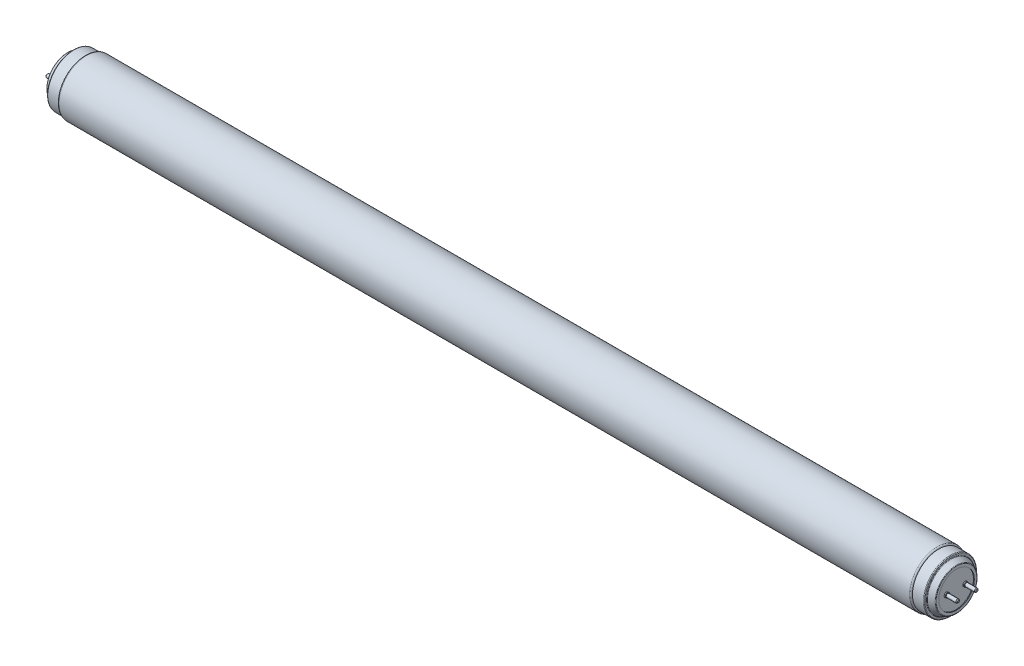
ISO-10303-21;
HEADER;
FILE_DESCRIPTION(('STEP AP214'),'2;1');
FILE_NAME('part.step','',(''),(''),'','','');
FILE_SCHEMA(('AUTOMOTIVE_DESIGN { 1 0 10303 214 1 1 1 1 }'));
ENDSEC;
DATA;
#1=APPLICATION_CONTEXT('core data for automotive mechanical design processes');
#2=APPLICATION_PROTOCOL_DEFINITION('international standard','automotive_design',2000,#1);
#3=PRODUCT_CONTEXT('',#1,'mechanical');
#4=PRODUCT('Part','Part','',(#3));
#5=PRODUCT_RELATED_PRODUCT_CATEGORY('part','',(#4));
#6=PRODUCT_DEFINITION_FORMATION('','',#4);
#7=PRODUCT_DEFINITION_CONTEXT('part definition',#1,'design');
#8=PRODUCT_DEFINITION('design','',#6,#7);
#9=PRODUCT_DEFINITION_SHAPE('','',#8);
#10=(LENGTH_UNIT() NAMED_UNIT(*) SI_UNIT(.MILLI.,.METRE.));
#11=(NAMED_UNIT(*) PLANE_ANGLE_UNIT() SI_UNIT($,.RADIAN.));
#12=(NAMED_UNIT(*) SI_UNIT($,.STERADIAN.) SOLID_ANGLE_UNIT());
#13=UNCERTAINTY_MEASURE_WITH_UNIT(LENGTH_MEASURE(1.E-05),#10,'distance_accuracy_value','');
#14=(GEOMETRIC_REPRESENTATION_CONTEXT(3) GLOBAL_UNCERTAINTY_ASSIGNED_CONTEXT((#13)) GLOBAL_UNIT_ASSIGNED_CONTEXT((#10,
#11,#12)) REPRESENTATION_CONTEXT('',''));
#15=CARTESIAN_POINT('',(0.,0.,0.));
#16=DIRECTION('',(0.,0.,1.));
#17=DIRECTION('',(1.,0.,0.));
#18=AXIS2_PLACEMENT_3D('',#15,#16,#17);
#19=CARTESIAN_POINT('',(587.5,-12.,0.));
#20=DIRECTION('',(-1.,0.,0.));
#21=DIRECTION('',(0.,0.,1.));
#22=AXIS2_PLACEMENT_3D('',#19,#20,#21);
#23=PLANE('',#22);
#24=CARTESIAN_POINT('',(587.5,0.,-6.3));
#25=DIRECTION('',(-1.,0.,0.));
#26=DIRECTION('',(0.,0.,1.));
#27=AXIS2_PLACEMENT_3D('',#24,#25,#26);
#28=CIRCLE('',#27,1.5);
#29=CARTESIAN_POINT('',(587.5,0.,-4.8));
#30=VERTEX_POINT('',#29);
#31=EDGE_CURVE('E77',#30,#30,#28,.F.);
#32=ORIENTED_EDGE('',*,*,#31,.F.);
#33=EDGE_LOOP('',(#32));
#34=FACE_BOUND('',#33,.T.);
#35=CARTESIAN_POINT('',(587.5,0.,0.));
#36=DIRECTION('',(1.,0.,0.));
#37=DIRECTION('',(0.,0.,-1.));
#38=AXIS2_PLACEMENT_3D('',#35,#36,#37);
#39=CIRCLE('',#38,12.);
#40=CARTESIAN_POINT('',(587.5,0.,-12.));
#41=VERTEX_POINT('',#40);
#42=EDGE_CURVE('E99',#41,#41,#39,.T.);
#43=ORIENTED_EDGE('',*,*,#42,.T.);
#44=EDGE_LOOP('',(#43));
#45=FACE_BOUND('',#44,.T.);
#46=CARTESIAN_POINT('',(587.5,0.,6.3));
#47=DIRECTION('',(-1.,0.,0.));
#48=DIRECTION('',(0.,0.,1.));
#49=AXIS2_PLACEMENT_3D('',#46,#47,#48);
#50=CIRCLE('',#49,1.5);
#51=CARTESIAN_POINT('',(587.5,0.,7.8));
#52=VERTEX_POINT('',#51);
#53=EDGE_CURVE('E74',#52,#52,#50,.F.);
#54=ORIENTED_EDGE('',*,*,#53,.F.);
#55=EDGE_LOOP('',(#54));
#56=FACE_BOUND('',#55,.T.);
#57=ADVANCED_FACE('F30',(#34,#45,#56),#23,.F.);
#58=CARTESIAN_POINT('',(-11.5,-12.,0.));
#59=DIRECTION('',(1.,0.,0.));
#60=DIRECTION('',(0.,0.,-1.));
#61=AXIS2_PLACEMENT_3D('',#58,#59,#60);
#62=PLANE('',#61);
#63=CARTESIAN_POINT('',(-11.5,0.,-6.3));
#64=DIRECTION('',(1.,0.,0.));
#65=DIRECTION('',(0.,0.,-1.));
#66=AXIS2_PLACEMENT_3D('',#63,#64,#65);
#67=CIRCLE('',#66,1.5);
#68=CARTESIAN_POINT('',(-11.5,0.,-7.8));
#69=VERTEX_POINT('',#68);
#70=EDGE_CURVE('E90',#69,#69,#67,.F.);
#71=ORIENTED_EDGE('',*,*,#70,.F.);
#72=EDGE_LOOP('',(#71));
#73=FACE_BOUND('',#72,.T.);
#74=CARTESIAN_POINT('',(-11.5,0.,0.));
#75=DIRECTION('',(1.,0.,0.));
#76=DIRECTION('',(0.,0.,-1.));
#77=AXIS2_PLACEMENT_3D('',#74,#75,#76);
#78=CIRCLE('',#77,12.);
#79=CARTESIAN_POINT('',(-11.5,0.,-12.));
#80=VERTEX_POINT('',#79);
#81=EDGE_CURVE('E96',#80,#80,#78,.T.);
#82=ORIENTED_EDGE('',*,*,#81,.F.);
#83=EDGE_LOOP('',(#82));
#84=FACE_BOUND('',#83,.T.);
#85=CARTESIAN_POINT('',(-11.5,0.,6.3));
#86=DIRECTION('',(1.,0.,0.));
#87=DIRECTION('',(0.,0.,-1.));
#88=AXIS2_PLACEMENT_3D('',#85,#86,#87);
#89=CIRCLE('',#88,1.5);
#90=CARTESIAN_POINT('',(-11.5,0.,4.8));
#91=VERTEX_POINT('',#90);
#92=EDGE_CURVE('E84',#91,#91,#89,.F.);
#93=ORIENTED_EDGE('',*,*,#92,.F.);
#94=EDGE_LOOP('',(#93));
#95=FACE_BOUND('',#94,.T.);
#96=ADVANCED_FACE('F273',(#73,#84,#95),#62,.F.);
#97=CARTESIAN_POINT('',(-11.5,0.,0.));
#98=DIRECTION('',(1.,0.,0.));
#99=DIRECTION('',(0.,0.,-1.));
#100=AXIS2_PLACEMENT_3D('',#97,#98,#99);
#101=CYLINDRICAL_SURFACE('',#100,12.);
#102=CARTESIAN_POINT('',(-12.,0.,0.));
#103=DIRECTION('',(1.,0.,0.));
#104=DIRECTION('',(0.,0.,-1.));
#105=AXIS2_PLACEMENT_3D('',#102,#103,#104);
#106=CIRCLE('',#105,12.);
#107=CARTESIAN_POINT('',(-12.,0.,-12.));
#108=VERTEX_POINT('',#107);
#109=EDGE_CURVE('E102',#108,#108,#106,.T.);
#110=ORIENTED_EDGE('',*,*,#109,.F.);
#111=EDGE_LOOP('',(#110));
#112=FACE_BOUND('',#111,.T.);
#113=ORIENTED_EDGE('',*,*,#81,.T.);
#114=EDGE_LOOP('',(#113));
#115=FACE_BOUND('',#114,.T.);
#116=ADVANCED_FACE('F267',(#112,#115),#101,.F.);
#117=CARTESIAN_POINT('',(-12.,-13.6909830056251,0.));
#118=DIRECTION('',(1.,0.,0.));
#119=DIRECTION('',(0.,0.,-1.));
#120=AXIS2_PLACEMENT_3D('',#117,#118,#119);
#121=PLANE('',#120);
#122=CARTESIAN_POINT('',(-12.,0.,0.));
#123=DIRECTION('',(1.,0.,0.));
#124=DIRECTION('',(0.,0.,-1.));
#125=AXIS2_PLACEMENT_3D('',#122,#123,#124);
#126=CIRCLE('',#125,13.6909830056251);
#127=CARTESIAN_POINT('',(-12.,0.,-13.6909830056251));
#128=VERTEX_POINT('',#127);
#129=EDGE_CURVE('E105',#128,#128,#126,.T.);
#130=ORIENTED_EDGE('',*,*,#129,.F.);
#131=EDGE_LOOP('',(#130));
#132=FACE_BOUND('',#131,.T.);
#133=ORIENTED_EDGE('',*,*,#109,.T.);
#134=EDGE_LOOP('',(#133));
#135=FACE_BOUND('',#134,.T.);
#136=ADVANCED_FACE('F261',(#132,#135),#121,.F.);
#137=CARTESIAN_POINT('',(-11.5,0.,0.));
#138=DIRECTION('',(1.,0.,0.));
#139=DIRECTION('',(0.,0.,-1.));
#140=AXIS2_PLACEMENT_3D('',#137,#138,#139);
#141=TOROIDAL_SURFACE('',#140,13.6909830056251,0.5);
#142=CARTESIAN_POINT('',(-11.72360679775,0.,0.));
#143=DIRECTION('',(1.,0.,0.));
#144=DIRECTION('',(0.,0.,-1.));
#145=AXIS2_PLACEMENT_3D('',#142,#143,#144);
#146=CIRCLE('',#145,14.138196601125);
#147=CARTESIAN_POINT('',(-11.72360679775,0.,-14.138196601125));
#148=VERTEX_POINT('',#147);
#149=EDGE_CURVE('E108',#148,#148,#146,.T.);
#150=ORIENTED_EDGE('',*,*,#149,.F.);
#151=EDGE_LOOP('',(#150));
#152=FACE_BOUND('',#151,.T.);
#153=ORIENTED_EDGE('',*,*,#129,.T.);
#154=EDGE_LOOP('',(#153));
#155=FACE_BOUND('',#154,.T.);
#156=ADVANCED_FACE('F255',(#152,#155),#141,.T.);
#157=CARTESIAN_POINT('',(-11.72360679775,0.,0.));
#158=DIRECTION('',(1.,0.,0.));
#159=DIRECTION('',(0.,0.,-1.));
#160=AXIS2_PLACEMENT_3D('',#157,#158,#159);
#161=CONICAL_SURFACE('',#160,14.138196601125,0.463647609000806);
#162=CARTESIAN_POINT('',(-8.27639320225002,0.,0.));
#163=DIRECTION('',(1.,0.,0.));
#164=DIRECTION('',(0.,0.,-1.));
#165=AXIS2_PLACEMENT_3D('',#162,#163,#164);
#166=CIRCLE('',#165,15.861803398875);
#167=CARTESIAN_POINT('',(-8.27639320225002,0.,-15.861803398875));
#168=VERTEX_POINT('',#167);
#169=EDGE_CURVE('E111',#168,#168,#166,.T.);
#170=ORIENTED_EDGE('',*,*,#169,.F.);
#171=EDGE_LOOP('',(#170));
#172=FACE_BOUND('',#171,.T.);
#173=ORIENTED_EDGE('',*,*,#149,.T.);
#174=EDGE_LOOP('',(#173));
#175=FACE_BOUND('',#174,.T.);
#176=ADVANCED_FACE('F249',(#172,#175),#161,.T.);
#177=CARTESIAN_POINT('',(-8.5,0.,0.));
#178=DIRECTION('',(1.,0.,0.));
#179=DIRECTION('',(0.,0.,-1.));
#180=AXIS2_PLACEMENT_3D('',#177,#178,#179);
#181=TOROIDAL_SURFACE('',#180,16.309016994375,0.500000000000001);
#182=CARTESIAN_POINT('',(-8.,0.,0.));
#183=DIRECTION('',(1.,0.,0.));
#184=DIRECTION('',(0.,0.,-1.));
#185=AXIS2_PLACEMENT_3D('',#182,#183,#184);
#186=CIRCLE('',#185,16.309016994375);
#187=CARTESIAN_POINT('',(-8.,0.,-16.309016994375));
#188=VERTEX_POINT('',#187);
#189=EDGE_CURVE('E114',#188,#188,#186,.T.);
#190=ORIENTED_EDGE('',*,*,#189,.F.);
#191=EDGE_LOOP('',(#190));
#192=FACE_BOUND('',#191,.T.);
#193=ORIENTED_EDGE('',*,*,#169,.T.);
#194=EDGE_LOOP('',(#193));
#195=FACE_BOUND('',#194,.T.);
#196=ADVANCED_FACE('F243',(#192,#195),#181,.F.);
#197=CARTESIAN_POINT('',(-8.,-17.25,0.));
#198=DIRECTION('',(1.,0.,0.));
#199=DIRECTION('',(0.,0.,-1.));
#200=AXIS2_PLACEMENT_3D('',#197,#198,#199);
#201=PLANE('',#200);
#202=CARTESIAN_POINT('',(-8.,0.,0.));
#203=DIRECTION('',(1.,0.,0.));
#204=DIRECTION('',(0.,0.,-1.));
#205=AXIS2_PLACEMENT_3D('',#202,#203,#204);
#206=CIRCLE('',#205,17.25);
#207=CARTESIAN_POINT('',(-8.,0.,-17.25));
#208=VERTEX_POINT('',#207);
#209=EDGE_CURVE('E117',#208,#208,#206,.T.);
#210=ORIENTED_EDGE('',*,*,#209,.F.);
#211=EDGE_LOOP('',(#210));
#212=FACE_BOUND('',#211,.T.);
#213=ORIENTED_EDGE('',*,*,#189,.T.);
#214=EDGE_LOOP('',(#213));
#215=FACE_BOUND('',#214,.T.);
#216=ADVANCED_FACE('F237',(#212,#215),#201,.F.);
#217=CARTESIAN_POINT('',(-7.5,0.,0.));
#218=DIRECTION('',(1.,0.,0.));
#219=DIRECTION('',(0.,0.,-1.));
#220=AXIS2_PLACEMENT_3D('',#217,#218,#219);
#221=TOROIDAL_SURFACE('',#220,17.25,0.5);
#222=CARTESIAN_POINT('',(-7.49999999999999,0.,0.));
#223=DIRECTION('',(1.,0.,0.));
#224=DIRECTION('',(0.,0.,-1.));
#225=AXIS2_PLACEMENT_3D('',#222,#223,#224);
#226=CIRCLE('',#225,17.75);
#227=CARTESIAN_POINT('',(-7.49999999999999,0.,-17.75));
#228=VERTEX_POINT('',#227);
#229=EDGE_CURVE('E120',#228,#228,#226,.T.);
#230=ORIENTED_EDGE('',*,*,#229,.F.);
#231=EDGE_LOOP('',(#230));
#232=FACE_BOUND('',#231,.T.);
#233=ORIENTED_EDGE('',*,*,#209,.T.);
#234=EDGE_LOOP('',(#233));
#235=FACE_BOUND('',#234,.T.);
#236=ADVANCED_FACE('F231',(#232,#235),#221,.T.);
#237=CARTESIAN_POINT('',(-11.5,0.,0.));
#238=DIRECTION('',(1.,0.,0.));
#239=DIRECTION('',(0.,0.,-1.));
#240=AXIS2_PLACEMENT_3D('',#237,#238,#239);
#241=CYLINDRICAL_SURFACE('',#240,17.75);
#242=CARTESIAN_POINT('',(0.,0.,0.));
#243=DIRECTION('',(1.,0.,0.));
#244=DIRECTION('',(0.,0.,-1.));
#245=AXIS2_PLACEMENT_3D('',#242,#243,#244);
#246=CIRCLE('',#245,17.75);
#247=CARTESIAN_POINT('',(0.,0.,-17.75));
#248=VERTEX_POINT('',#247);
#249=EDGE_CURVE('E123',#248,#248,#246,.T.);
#250=ORIENTED_EDGE('',*,*,#249,.F.);
#251=EDGE_LOOP('',(#250));
#252=FACE_BOUND('',#251,.T.);
#253=ORIENTED_EDGE('',*,*,#229,.T.);
#254=EDGE_LOOP('',(#253));
#255=FACE_BOUND('',#254,.T.);
#256=ADVANCED_FACE('F225',(#252,#255),#241,.T.);
#257=CARTESIAN_POINT('',(0.950000000000002,0.,0.));
#258=DIRECTION('',(1.,0.,0.));
#259=DIRECTION('',(0.,0.,-1.));
#260=AXIS2_PLACEMENT_3D('',#257,#258,#259);
#261=TOROIDAL_SURFACE('',#260,17.75,0.950000000000001);
#262=CARTESIAN_POINT('',(0.950000000000001,0.,0.));
#263=DIRECTION('',(1.,0.,0.));
#264=DIRECTION('',(0.,0.,-1.));
#265=AXIS2_PLACEMENT_3D('',#262,#263,#264);
#266=CIRCLE('',#265,18.7);
#267=CARTESIAN_POINT('',(0.950000000000001,0.,-18.7));
#268=VERTEX_POINT('',#267);
#269=EDGE_CURVE('E126',#268,#268,#266,.T.);
#270=ORIENTED_EDGE('',*,*,#269,.F.);
#271=EDGE_LOOP('',(#270));
#272=FACE_BOUND('',#271,.T.);
#273=ORIENTED_EDGE('',*,*,#249,.T.);
#274=EDGE_LOOP('',(#273));
#275=FACE_BOUND('',#274,.T.);
#276=ADVANCED_FACE('F219',(#272,#275),#261,.T.);
#277=CARTESIAN_POINT('',(-11.5,0.,0.));
#278=DIRECTION('',(1.,0.,0.));
#279=DIRECTION('',(0.,0.,-1.));
#280=AXIS2_PLACEMENT_3D('',#277,#278,#279);
#281=CYLINDRICAL_SURFACE('',#280,18.7);
#282=CARTESIAN_POINT('',(575.05,0.,0.));
#283=DIRECTION('',(1.,0.,0.));
#284=DIRECTION('',(0.,0.,-1.));
#285=AXIS2_PLACEMENT_3D('',#282,#283,#284);
#286=CIRCLE('',#285,18.7);
#287=CARTESIAN_POINT('',(575.05,0.,-18.7));
#288=VERTEX_POINT('',#287);
#289=EDGE_CURVE('E129',#288,#288,#286,.T.);
#290=ORIENTED_EDGE('',*,*,#289,.F.);
#291=EDGE_LOOP('',(#290));
#292=FACE_BOUND('',#291,.T.);
#293=ORIENTED_EDGE('',*,*,#269,.T.);
#294=EDGE_LOOP('',(#293));
#295=FACE_BOUND('',#294,.T.);
#296=ADVANCED_FACE('F213',(#292,#295),#281,.T.);
#297=CARTESIAN_POINT('',(575.05,0.,0.));
#298=DIRECTION('',(1.,0.,0.));
#299=DIRECTION('',(0.,0.,-1.));
#300=AXIS2_PLACEMENT_3D('',#297,#298,#299);
#301=TOROIDAL_SURFACE('',#300,17.75,0.950000000000005);
#302=CARTESIAN_POINT('',(576.,0.,0.));
#303=DIRECTION('',(1.,0.,0.));
#304=DIRECTION('',(0.,0.,-1.));
#305=AXIS2_PLACEMENT_3D('',#302,#303,#304);
#306=CIRCLE('',#305,17.75);
#307=CARTESIAN_POINT('',(576.,0.,-17.75));
#308=VERTEX_POINT('',#307);
#309=EDGE_CURVE('E132',#308,#308,#306,.T.);
#310=ORIENTED_EDGE('',*,*,#309,.F.);
#311=EDGE_LOOP('',(#310));
#312=FACE_BOUND('',#311,.T.);
#313=ORIENTED_EDGE('',*,*,#289,.T.);
#314=EDGE_LOOP('',(#313));
#315=FACE_BOUND('',#314,.T.);
#316=ADVANCED_FACE('F207',(#312,#315),#301,.T.);
#317=CARTESIAN_POINT('',(-11.5,0.,0.));
#318=DIRECTION('',(1.,0.,0.));
#319=DIRECTION('',(0.,0.,-1.));
#320=AXIS2_PLACEMENT_3D('',#317,#318,#319);
#321=CYLINDRICAL_SURFACE('',#320,17.75);
#322=CARTESIAN_POINT('',(583.5,0.,0.));
#323=DIRECTION('',(1.,0.,0.));
#324=DIRECTION('',(0.,0.,-1.));
#325=AXIS2_PLACEMENT_3D('',#322,#323,#324);
#326=CIRCLE('',#325,17.75);
#327=CARTESIAN_POINT('',(583.5,0.,-17.75));
#328=VERTEX_POINT('',#327);
#329=EDGE_CURVE('E135',#328,#328,#326,.T.);
#330=ORIENTED_EDGE('',*,*,#329,.F.);
#331=EDGE_LOOP('',(#330));
#332=FACE_BOUND('',#331,.T.);
#333=ORIENTED_EDGE('',*,*,#309,.T.);
#334=EDGE_LOOP('',(#333));
#335=FACE_BOUND('',#334,.T.);
#336=ADVANCED_FACE('F201',(#332,#335),#321,.T.);
#337=CARTESIAN_POINT('',(583.5,0.,0.));
#338=DIRECTION('',(1.,0.,0.));
#339=DIRECTION('',(0.,0.,-1.));
#340=AXIS2_PLACEMENT_3D('',#337,#338,#339);
#341=TOROIDAL_SURFACE('',#340,17.25,0.499999999999974);
#342=CARTESIAN_POINT('',(584.,0.,0.));
#343=DIRECTION('',(1.,0.,0.));
#344=DIRECTION('',(0.,0.,-1.));
#345=AXIS2_PLACEMENT_3D('',#342,#343,#344);
#346=CIRCLE('',#345,17.25);
#347=CARTESIAN_POINT('',(584.,0.,-17.25));
#348=VERTEX_POINT('',#347);
#349=EDGE_CURVE('E138',#348,#348,#346,.T.);
#350=ORIENTED_EDGE('',*,*,#349,.F.);
#351=EDGE_LOOP('',(#350));
#352=FACE_BOUND('',#351,.T.);
#353=ORIENTED_EDGE('',*,*,#329,.T.);
#354=EDGE_LOOP('',(#353));
#355=FACE_BOUND('',#354,.T.);
#356=ADVANCED_FACE('F195',(#352,#355),#341,.T.);
#357=CARTESIAN_POINT('',(584.,-17.25,0.));
#358=DIRECTION('',(-1.,0.,0.));
#359=DIRECTION('',(0.,0.,1.));
#360=AXIS2_PLACEMENT_3D('',#357,#358,#359);
#361=PLANE('',#360);
#362=CARTESIAN_POINT('',(584.,0.,0.));
#363=DIRECTION('',(1.,0.,0.));
#364=DIRECTION('',(0.,0.,-1.));
#365=AXIS2_PLACEMENT_3D('',#362,#363,#364);
#366=CIRCLE('',#365,16.3090169943749);
#367=CARTESIAN_POINT('',(584.,0.,-16.3090169943749));
#368=VERTEX_POINT('',#367);
#369=EDGE_CURVE('E141',#368,#368,#366,.T.);
#370=ORIENTED_EDGE('',*,*,#369,.F.);
#371=EDGE_LOOP('',(#370));
#372=FACE_BOUND('',#371,.T.);
#373=ORIENTED_EDGE('',*,*,#349,.T.);
#374=EDGE_LOOP('',(#373));
#375=FACE_BOUND('',#374,.T.);
#376=ADVANCED_FACE('F189',(#372,#375),#361,.F.);
#377=CARTESIAN_POINT('',(584.5,0.,0.));
#378=DIRECTION('',(1.,0.,0.));
#379=DIRECTION('',(0.,0.,-1.));
#380=AXIS2_PLACEMENT_3D('',#377,#378,#379);
#381=TOROIDAL_SURFACE('',#380,16.3090169943749,0.500000000000037);
#382=CARTESIAN_POINT('',(584.27639320225,0.,0.));
#383=DIRECTION('',(1.,0.,0.));
#384=DIRECTION('',(0.,0.,-1.));
#385=AXIS2_PLACEMENT_3D('',#382,#383,#384);
#386=CIRCLE('',#385,15.861803398875);
#387=CARTESIAN_POINT('',(584.27639320225,0.,-15.861803398875));
#388=VERTEX_POINT('',#387);
#389=EDGE_CURVE('E144',#388,#388,#386,.T.);
#390=ORIENTED_EDGE('',*,*,#389,.F.);
#391=EDGE_LOOP('',(#390));
#392=FACE_BOUND('',#391,.T.);
#393=ORIENTED_EDGE('',*,*,#369,.T.);
#394=EDGE_LOOP('',(#393));
#395=FACE_BOUND('',#394,.T.);
#396=ADVANCED_FACE('F183',(#392,#395),#381,.F.);
#397=CARTESIAN_POINT('',(584.27639320225,0.,0.));
#398=DIRECTION('',(-1.,0.,0.));
#399=DIRECTION('',(0.,0.,1.));
#400=AXIS2_PLACEMENT_3D('',#397,#398,#399);
#401=CONICAL_SURFACE('',#400,15.861803398875,0.463647609000804);
#402=CARTESIAN_POINT('',(587.72360679775,0.,0.));
#403=DIRECTION('',(1.,0.,0.));
#404=DIRECTION('',(0.,0.,-1.));
#405=AXIS2_PLACEMENT_3D('',#402,#403,#404);
#406=CIRCLE('',#405,14.138196601125);
#407=CARTESIAN_POINT('',(587.72360679775,0.,-14.138196601125));
#408=VERTEX_POINT('',#407);
#409=EDGE_CURVE('E147',#408,#408,#406,.T.);
#410=ORIENTED_EDGE('',*,*,#409,.F.);
#411=EDGE_LOOP('',(#410));
#412=FACE_BOUND('',#411,.T.);
#413=ORIENTED_EDGE('',*,*,#389,.T.);
#414=EDGE_LOOP('',(#413));
#415=FACE_BOUND('',#414,.T.);
#416=ADVANCED_FACE('F177',(#412,#415),#401,.T.);
#417=CARTESIAN_POINT('',(587.5,0.,0.));
#418=DIRECTION('',(1.,0.,0.));
#419=DIRECTION('',(0.,0.,-1.));
#420=AXIS2_PLACEMENT_3D('',#417,#418,#419);
#421=TOROIDAL_SURFACE('',#420,13.6909830056251,0.499999999999957);
#422=CARTESIAN_POINT('',(588.,0.,0.));
#423=DIRECTION('',(1.,0.,0.));
#424=DIRECTION('',(0.,0.,-1.));
#425=AXIS2_PLACEMENT_3D('',#422,#423,#424);
#426=CIRCLE('',#425,13.6909830056251);
#427=CARTESIAN_POINT('',(588.,0.,-13.6909830056251));
#428=VERTEX_POINT('',#427);
#429=EDGE_CURVE('E150',#428,#428,#426,.T.);
#430=ORIENTED_EDGE('',*,*,#429,.F.);
#431=EDGE_LOOP('',(#430));
#432=FACE_BOUND('',#431,.T.);
#433=ORIENTED_EDGE('',*,*,#409,.T.);
#434=EDGE_LOOP('',(#433));
#435=FACE_BOUND('',#434,.T.);
#436=ADVANCED_FACE('F171',(#432,#435),#421,.T.);
#437=CARTESIAN_POINT('',(588.,-13.6909830056251,0.));
#438=DIRECTION('',(-1.,0.,0.));
#439=DIRECTION('',(0.,0.,1.));
#440=AXIS2_PLACEMENT_3D('',#437,#438,#439);
#441=PLANE('',#440);
#442=CARTESIAN_POINT('',(588.,0.,0.));
#443=DIRECTION('',(1.,0.,0.));
#444=DIRECTION('',(0.,0.,-1.));
#445=AXIS2_PLACEMENT_3D('',#442,#443,#444);
#446=CIRCLE('',#445,12.);
#447=CARTESIAN_POINT('',(588.,0.,-12.));
#448=VERTEX_POINT('',#447);
#449=EDGE_CURVE('E153',#448,#448,#446,.T.);
#450=ORIENTED_EDGE('',*,*,#449,.F.);
#451=EDGE_LOOP('',(#450));
#452=FACE_BOUND('',#451,.T.);
#453=ORIENTED_EDGE('',*,*,#429,.T.);
#454=EDGE_LOOP('',(#453));
#455=FACE_BOUND('',#454,.T.);
#456=ADVANCED_FACE('F165',(#452,#455),#441,.F.);
#457=CARTESIAN_POINT('',(-11.5,0.,0.));
#458=DIRECTION('',(1.,0.,0.));
#459=DIRECTION('',(0.,0.,-1.));
#460=AXIS2_PLACEMENT_3D('',#457,#458,#459);
#461=CYLINDRICAL_SURFACE('',#460,12.);
#462=ORIENTED_EDGE('',*,*,#42,.F.);
#463=EDGE_LOOP('',(#462));
#464=FACE_BOUND('',#463,.T.);
#465=ORIENTED_EDGE('',*,*,#449,.T.);
#466=EDGE_LOOP('',(#465));
#467=FACE_BOUND('',#466,.T.);
#468=ADVANCED_FACE('F161',(#464,#467),#461,.F.);
#469=CARTESIAN_POINT('',(-12.5,0.,-6.3));
#470=DIRECTION('',(1.,0.,0.));
#471=DIRECTION('',(0.,0.,-1.));
#472=AXIS2_PLACEMENT_3D('',#469,#470,#471);
#473=CYLINDRICAL_SURFACE('',#472,1.5);
#474=CARTESIAN_POINT('',(-12.2,0.,-6.3));
#475=DIRECTION('',(-1.,0.,0.));
#476=DIRECTION('',(0.,0.,1.));
#477=AXIS2_PLACEMENT_3D('',#474,#475,#476);
#478=CIRCLE('',#477,1.5);
#479=CARTESIAN_POINT('',(-12.2,0.,-4.8));
#480=VERTEX_POINT('',#479);
#481=EDGE_CURVE('E62',#480,#480,#478,.F.);
#482=ORIENTED_EDGE('',*,*,#481,.T.);
#483=EDGE_LOOP('',(#482));
#484=FACE_BOUND('',#483,.T.);
#485=ORIENTED_EDGE('',*,*,#70,.T.);
#486=EDGE_LOOP('',(#485));
#487=FACE_BOUND('',#486,.T.);
#488=ADVANCED_FACE('F164',(#484,#487),#473,.T.);
#489=CARTESIAN_POINT('',(-19.5,0.,-6.3));
#490=DIRECTION('',(-1.,0.,0.));
#491=DIRECTION('',(0.,0.,1.));
#492=AXIS2_PLACEMENT_3D('',#489,#490,#491);
#493=PLANE('',#492);
#494=CARTESIAN_POINT('',(-19.5,0.,-6.3));
#495=DIRECTION('',(-1.,0.,0.));
#496=DIRECTION('',(0.,0.,1.));
#497=AXIS2_PLACEMENT_3D('',#494,#495,#496);
#498=CIRCLE('',#497,0.700000000000089);
#499=CARTESIAN_POINT('',(-19.5,0.,-5.59999999999991));
#500=VERTEX_POINT('',#499);
#501=EDGE_CURVE('E37',#500,#500,#498,.T.);
#502=ORIENTED_EDGE('',*,*,#501,.T.);
#503=EDGE_LOOP('',(#502));
#504=FACE_BOUND('',#503,.T.);
#505=ADVANCED_FACE('F296',(#504),#493,.T.);
#506=CARTESIAN_POINT('',(-19.5,0.,-6.3));
#507=DIRECTION('',(1.,0.,0.));
#508=DIRECTION('',(0.,0.,-1.));
#509=AXIS2_PLACEMENT_3D('',#506,#507,#508);
#510=CYLINDRICAL_SURFACE('',#509,1.2);
#511=CARTESIAN_POINT('',(-19.0000000000001,0.,-6.3));
#512=DIRECTION('',(-1.,0.,0.));
#513=DIRECTION('',(0.,0.,1.));
#514=AXIS2_PLACEMENT_3D('',#511,#512,#513);
#515=CIRCLE('',#514,1.2);
#516=CARTESIAN_POINT('',(-19.0000000000001,0.,-5.1));
#517=VERTEX_POINT('',#516);
#518=EDGE_CURVE('E10',#517,#517,#515,.F.);
#519=ORIENTED_EDGE('',*,*,#518,.T.);
#520=EDGE_LOOP('',(#519));
#521=FACE_BOUND('',#520,.T.);
#522=CARTESIAN_POINT('',(-12.5,0.,-6.3));
#523=DIRECTION('',(-1.,0.,0.));
#524=DIRECTION('',(0.,0.,1.));
#525=AXIS2_PLACEMENT_3D('',#522,#523,#524);
#526=CIRCLE('',#525,1.2);
#527=CARTESIAN_POINT('',(-12.5,0.,-5.1));
#528=VERTEX_POINT('',#527);
#529=EDGE_CURVE('E93',#528,#528,#526,.T.);
#530=ORIENTED_EDGE('',*,*,#529,.T.);
#531=EDGE_LOOP('',(#530));
#532=FACE_BOUND('',#531,.T.);
#533=ADVANCED_FACE('F286',(#521,#532),#510,.T.);
#534=CARTESIAN_POINT('',(-12.5,0.,6.3));
#535=DIRECTION('',(1.,0.,0.));
#536=DIRECTION('',(0.,0.,-1.));
#537=AXIS2_PLACEMENT_3D('',#534,#535,#536);
#538=CYLINDRICAL_SURFACE('',#537,1.5);
#539=CARTESIAN_POINT('',(-12.2,0.,6.3));
#540=DIRECTION('',(-1.,0.,0.));
#541=DIRECTION('',(0.,0.,1.));
#542=AXIS2_PLACEMENT_3D('',#539,#540,#541);
#543=CIRCLE('',#542,1.5);
#544=CARTESIAN_POINT('',(-12.2,0.,7.8));
#545=VERTEX_POINT('',#544);
#546=EDGE_CURVE('E65',#545,#545,#543,.F.);
#547=ORIENTED_EDGE('',*,*,#546,.T.);
#548=EDGE_LOOP('',(#547));
#549=FACE_BOUND('',#548,.T.);
#550=ORIENTED_EDGE('',*,*,#92,.T.);
#551=EDGE_LOOP('',(#550));
#552=FACE_BOUND('',#551,.T.);
#553=ADVANCED_FACE('F283',(#549,#552),#538,.T.);
#554=CARTESIAN_POINT('',(-19.5,0.,6.3));
#555=DIRECTION('',(-1.,0.,0.));
#556=DIRECTION('',(0.,0.,1.));
#557=AXIS2_PLACEMENT_3D('',#554,#555,#556);
#558=PLANE('',#557);
#559=CARTESIAN_POINT('',(-19.5,0.,6.3));
#560=DIRECTION('',(-1.,0.,0.));
#561=DIRECTION('',(0.,0.,1.));
#562=AXIS2_PLACEMENT_3D('',#559,#560,#561);
#563=CIRCLE('',#562,0.700000000000089);
#564=CARTESIAN_POINT('',(-19.5,0.,7.00000000000009));
#565=VERTEX_POINT('',#564);
#566=EDGE_CURVE('E45',#565,#565,#563,.T.);
#567=ORIENTED_EDGE('',*,*,#566,.T.);
#568=EDGE_LOOP('',(#567));
#569=FACE_BOUND('',#568,.T.);
#570=ADVANCED_FACE('F285',(#569),#558,.T.);
#571=CARTESIAN_POINT('',(-19.5,0.,6.3));
#572=DIRECTION('',(1.,0.,0.));
#573=DIRECTION('',(0.,0.,-1.));
#574=AXIS2_PLACEMENT_3D('',#571,#572,#573);
#575=CYLINDRICAL_SURFACE('',#574,1.2);
#576=CARTESIAN_POINT('',(-19.0000000000001,0.,6.3));
#577=DIRECTION('',(-1.,0.,0.));
#578=DIRECTION('',(0.,0.,1.));
#579=AXIS2_PLACEMENT_3D('',#576,#577,#578);
#580=CIRCLE('',#579,1.2);
#581=CARTESIAN_POINT('',(-19.0000000000001,0.,7.5));
#582=VERTEX_POINT('',#581);
#583=EDGE_CURVE('E41',#582,#582,#580,.F.);
#584=ORIENTED_EDGE('',*,*,#583,.T.);
#585=EDGE_LOOP('',(#584));
#586=FACE_BOUND('',#585,.T.);
#587=CARTESIAN_POINT('',(-12.5,0.,6.3));
#588=DIRECTION('',(-1.,0.,0.));
#589=DIRECTION('',(0.,0.,1.));
#590=AXIS2_PLACEMENT_3D('',#587,#588,#589);
#591=CIRCLE('',#590,1.2);
#592=CARTESIAN_POINT('',(-12.5,0.,7.5));
#593=VERTEX_POINT('',#592);
#594=EDGE_CURVE('E87',#593,#593,#591,.T.);
#595=ORIENTED_EDGE('',*,*,#594,.T.);
#596=EDGE_LOOP('',(#595));
#597=FACE_BOUND('',#596,.T.);
#598=ADVANCED_FACE('F293',(#586,#597),#575,.T.);
#599=CARTESIAN_POINT('',(588.5,0.,-6.3));
#600=DIRECTION('',(-1.,0.,0.));
#601=DIRECTION('',(0.,0.,1.));
#602=AXIS2_PLACEMENT_3D('',#599,#600,#601);
#603=CYLINDRICAL_SURFACE('',#602,1.5);
#604=CARTESIAN_POINT('',(588.2,0.,-6.3));
#605=DIRECTION('',(1.,0.,0.));
#606=DIRECTION('',(0.,0.,-1.));
#607=AXIS2_PLACEMENT_3D('',#604,#605,#606);
#608=CIRCLE('',#607,1.5);
#609=CARTESIAN_POINT('',(588.2,0.,-7.8));
#610=VERTEX_POINT('',#609);
#611=EDGE_CURVE('E71',#610,#610,#608,.F.);
#612=ORIENTED_EDGE('',*,*,#611,.T.);
#613=EDGE_LOOP('',(#612));
#614=FACE_BOUND('',#613,.T.);
#615=ORIENTED_EDGE('',*,*,#31,.T.);
#616=EDGE_LOOP('',(#615));
#617=FACE_BOUND('',#616,.T.);
#618=ADVANCED_FACE('F345',(#614,#617),#603,.T.);
#619=CARTESIAN_POINT('',(595.5,0.,-6.3));
#620=DIRECTION('',(1.,0.,0.));
#621=DIRECTION('',(0.,0.,-1.));
#622=AXIS2_PLACEMENT_3D('',#619,#620,#621);
#623=PLANE('',#622);
#624=CARTESIAN_POINT('',(595.5,0.,-6.3));
#625=DIRECTION('',(1.,0.,0.));
#626=DIRECTION('',(0.,0.,-1.));
#627=AXIS2_PLACEMENT_3D('',#624,#625,#626);
#628=CIRCLE('',#627,0.700000000000089);
#629=CARTESIAN_POINT('',(595.5,0.,-7.00000000000009));
#630=VERTEX_POINT('',#629);
#631=EDGE_CURVE('E59',#630,#630,#628,.T.);
#632=ORIENTED_EDGE('',*,*,#631,.T.);
#633=EDGE_LOOP('',(#632));
#634=FACE_BOUND('',#633,.T.);
#635=ADVANCED_FACE('F352',(#634),#623,.T.);
#636=CARTESIAN_POINT('',(595.5,0.,-6.3));
#637=DIRECTION('',(-1.,0.,0.));
#638=DIRECTION('',(0.,0.,1.));
#639=AXIS2_PLACEMENT_3D('',#636,#637,#638);
#640=CYLINDRICAL_SURFACE('',#639,1.2);
#641=CARTESIAN_POINT('',(595.,0.,-6.3));
#642=DIRECTION('',(1.,0.,0.));
#643=DIRECTION('',(0.,0.,-1.));
#644=AXIS2_PLACEMENT_3D('',#641,#642,#643);
#645=CIRCLE('',#644,1.2);
#646=CARTESIAN_POINT('',(595.,0.,-7.5));
#647=VERTEX_POINT('',#646);
#648=EDGE_CURVE('E56',#647,#647,#645,.F.);
#649=ORIENTED_EDGE('',*,*,#648,.T.);
#650=EDGE_LOOP('',(#649));
#651=FACE_BOUND('',#650,.T.);
#652=CARTESIAN_POINT('',(588.5,0.,-6.3));
#653=DIRECTION('',(1.,0.,0.));
#654=DIRECTION('',(0.,0.,-1.));
#655=AXIS2_PLACEMENT_3D('',#652,#653,#654);
#656=CIRCLE('',#655,1.2);
#657=CARTESIAN_POINT('',(588.5,0.,-7.5));
#658=VERTEX_POINT('',#657);
#659=EDGE_CURVE('E81',#658,#658,#656,.T.);
#660=ORIENTED_EDGE('',*,*,#659,.T.);
#661=EDGE_LOOP('',(#660));
#662=FACE_BOUND('',#661,.T.);
#663=ADVANCED_FACE('F472',(#651,#662),#640,.T.);
#664=CARTESIAN_POINT('',(588.5,0.,6.3));
#665=DIRECTION('',(-1.,0.,0.));
#666=DIRECTION('',(0.,0.,1.));
#667=AXIS2_PLACEMENT_3D('',#664,#665,#666);
#668=CYLINDRICAL_SURFACE('',#667,1.5);
#669=CARTESIAN_POINT('',(588.2,0.,6.3));
#670=DIRECTION('',(1.,0.,0.));
#671=DIRECTION('',(0.,0.,-1.));
#672=AXIS2_PLACEMENT_3D('',#669,#670,#671);
#673=CIRCLE('',#672,1.5);
#674=CARTESIAN_POINT('',(588.2,0.,4.8));
#675=VERTEX_POINT('',#674);
#676=EDGE_CURVE('E68',#675,#675,#673,.F.);
#677=ORIENTED_EDGE('',*,*,#676,.T.);
#678=EDGE_LOOP('',(#677));
#679=FACE_BOUND('',#678,.T.);
#680=ORIENTED_EDGE('',*,*,#53,.T.);
#681=EDGE_LOOP('',(#680));
#682=FACE_BOUND('',#681,.T.);
#683=ADVANCED_FACE('F467',(#679,#682),#668,.T.);
#684=CARTESIAN_POINT('',(595.5,0.,6.3));
#685=DIRECTION('',(1.,0.,0.));
#686=DIRECTION('',(0.,0.,-1.));
#687=AXIS2_PLACEMENT_3D('',#684,#685,#686);
#688=PLANE('',#687);
#689=CARTESIAN_POINT('',(595.5,0.,6.3));
#690=DIRECTION('',(1.,0.,0.));
#691=DIRECTION('',(0.,0.,-1.));
#692=AXIS2_PLACEMENT_3D('',#689,#690,#691);
#693=CIRCLE('',#692,0.700000000000089);
#694=CARTESIAN_POINT('',(595.5,0.,5.59999999999991));
#695=VERTEX_POINT('',#694);
#696=EDGE_CURVE('E53',#695,#695,#693,.T.);
#697=ORIENTED_EDGE('',*,*,#696,.T.);
#698=EDGE_LOOP('',(#697));
#699=FACE_BOUND('',#698,.T.);
#700=ADVANCED_FACE('F456',(#699),#688,.T.);
#701=CARTESIAN_POINT('',(595.5,0.,6.3));
#702=DIRECTION('',(-1.,0.,0.));
#703=DIRECTION('',(0.,0.,1.));
#704=AXIS2_PLACEMENT_3D('',#701,#702,#703);
#705=CYLINDRICAL_SURFACE('',#704,1.2);
#706=CARTESIAN_POINT('',(595.,0.,6.3));
#707=DIRECTION('',(1.,0.,0.));
#708=DIRECTION('',(0.,0.,-1.));
#709=AXIS2_PLACEMENT_3D('',#706,#707,#708);
#710=CIRCLE('',#709,1.2);
#711=CARTESIAN_POINT('',(595.,0.,5.1));
#712=VERTEX_POINT('',#711);
#713=EDGE_CURVE('E50',#712,#712,#710,.F.);
#714=ORIENTED_EDGE('',*,*,#713,.T.);
#715=EDGE_LOOP('',(#714));
#716=FACE_BOUND('',#715,.T.);
#717=CARTESIAN_POINT('',(588.5,0.,6.3));
#718=DIRECTION('',(1.,0.,0.));
#719=DIRECTION('',(0.,0.,-1.));
#720=AXIS2_PLACEMENT_3D('',#717,#718,#719);
#721=CIRCLE('',#720,1.2);
#722=CARTESIAN_POINT('',(588.5,0.,5.1));
#723=VERTEX_POINT('',#722);
#724=EDGE_CURVE('E78',#723,#723,#721,.T.);
#725=ORIENTED_EDGE('',*,*,#724,.T.);
#726=EDGE_LOOP('',(#725));
#727=FACE_BOUND('',#726,.T.);
#728=ADVANCED_FACE('F312',(#716,#727),#705,.T.);
#729=CARTESIAN_POINT('',(588.5,0.,-6.3));
#730=DIRECTION('',(-1.,0.,0.));
#731=DIRECTION('',(0.,0.,1.));
#732=AXIS2_PLACEMENT_3D('',#729,#730,#731);
#733=CONICAL_SURFACE('',#732,1.20000000000009,0.785398163397353);
#734=ORIENTED_EDGE('',*,*,#611,.F.);
#735=EDGE_LOOP('',(#734));
#736=FACE_BOUND('',#735,.T.);
#737=ORIENTED_EDGE('',*,*,#659,.F.);
#738=EDGE_LOOP('',(#737));
#739=FACE_BOUND('',#738,.T.);
#740=ADVANCED_FACE('F308',(#736,#739),#733,.T.);
#741=CARTESIAN_POINT('',(588.5,0.,6.3));
#742=DIRECTION('',(-1.,0.,0.));
#743=DIRECTION('',(0.,0.,1.));
#744=AXIS2_PLACEMENT_3D('',#741,#742,#743);
#745=CONICAL_SURFACE('',#744,1.20000000000009,0.785398163397353);
#746=ORIENTED_EDGE('',*,*,#676,.F.);
#747=EDGE_LOOP('',(#746));
#748=FACE_BOUND('',#747,.T.);
#749=ORIENTED_EDGE('',*,*,#724,.F.);
#750=EDGE_LOOP('',(#749));
#751=FACE_BOUND('',#750,.T.);
#752=ADVANCED_FACE('F311',(#748,#751),#745,.T.);
#753=CARTESIAN_POINT('',(-12.5,0.,6.3));
#754=DIRECTION('',(1.,0.,0.));
#755=DIRECTION('',(0.,0.,-1.));
#756=AXIS2_PLACEMENT_3D('',#753,#754,#755);
#757=CONICAL_SURFACE('',#756,1.19999999999992,0.785398163397535);
#758=ORIENTED_EDGE('',*,*,#546,.F.);
#759=EDGE_LOOP('',(#758));
#760=FACE_BOUND('',#759,.T.);
#761=ORIENTED_EDGE('',*,*,#594,.F.);
#762=EDGE_LOOP('',(#761));
#763=FACE_BOUND('',#762,.T.);
#764=ADVANCED_FACE('F316',(#760,#763),#757,.T.);
#765=CARTESIAN_POINT('',(-12.5,0.,-6.3));
#766=DIRECTION('',(1.,0.,0.));
#767=DIRECTION('',(0.,0.,-1.));
#768=AXIS2_PLACEMENT_3D('',#765,#766,#767);
#769=CONICAL_SURFACE('',#768,1.19999999999992,0.785398163397535);
#770=ORIENTED_EDGE('',*,*,#481,.F.);
#771=EDGE_LOOP('',(#770));
#772=FACE_BOUND('',#771,.T.);
#773=ORIENTED_EDGE('',*,*,#529,.F.);
#774=EDGE_LOOP('',(#773));
#775=FACE_BOUND('',#774,.T.);
#776=ADVANCED_FACE('F320',(#772,#775),#769,.T.);
#777=CARTESIAN_POINT('',(595.5,0.,-6.3));
#778=DIRECTION('',(-1.,0.,0.));
#779=DIRECTION('',(0.,0.,1.));
#780=AXIS2_PLACEMENT_3D('',#777,#778,#779);
#781=CONICAL_SURFACE('',#780,0.700000000000089,0.785398163397413);
#782=ORIENTED_EDGE('',*,*,#648,.F.);
#783=EDGE_LOOP('',(#782));
#784=FACE_BOUND('',#783,.T.);
#785=ORIENTED_EDGE('',*,*,#631,.F.);
#786=EDGE_LOOP('',(#785));
#787=FACE_BOUND('',#786,.T.);
#788=ADVANCED_FACE('F324',(#784,#787),#781,.T.);
#789=CARTESIAN_POINT('',(595.5,0.,6.3));
#790=DIRECTION('',(-1.,0.,0.));
#791=DIRECTION('',(0.,0.,1.));
#792=AXIS2_PLACEMENT_3D('',#789,#790,#791);
#793=CONICAL_SURFACE('',#792,0.700000000000089,0.785398163397413);
#794=ORIENTED_EDGE('',*,*,#713,.F.);
#795=EDGE_LOOP('',(#794));
#796=FACE_BOUND('',#795,.T.);
#797=ORIENTED_EDGE('',*,*,#696,.F.);
#798=EDGE_LOOP('',(#797));
#799=FACE_BOUND('',#798,.T.);
#800=ADVANCED_FACE('F328',(#796,#799),#793,.T.);
#801=CARTESIAN_POINT('',(-19.5,0.,6.3));
#802=DIRECTION('',(1.,0.,0.));
#803=DIRECTION('',(0.,0.,-1.));
#804=AXIS2_PLACEMENT_3D('',#801,#802,#803);
#805=CONICAL_SURFACE('',#804,0.700000000000089,0.785398163397445);
#806=ORIENTED_EDGE('',*,*,#583,.F.);
#807=EDGE_LOOP('',(#806));
#808=FACE_BOUND('',#807,.T.);
#809=ORIENTED_EDGE('',*,*,#566,.F.);
#810=EDGE_LOOP('',(#809));
#811=FACE_BOUND('',#810,.T.);
#812=ADVANCED_FACE('F331',(#808,#811),#805,.T.);
#813=CARTESIAN_POINT('',(-19.5,0.,-6.3));
#814=DIRECTION('',(1.,0.,0.));
#815=DIRECTION('',(0.,0.,-1.));
#816=AXIS2_PLACEMENT_3D('',#813,#814,#815);
#817=CONICAL_SURFACE('',#816,0.700000000000089,0.785398163397445);
#818=ORIENTED_EDGE('',*,*,#518,.F.);
#819=EDGE_LOOP('',(#818));
#820=FACE_BOUND('',#819,.T.);
#821=ORIENTED_EDGE('',*,*,#501,.F.);
#822=EDGE_LOOP('',(#821));
#823=FACE_BOUND('',#822,.T.);
#824=ADVANCED_FACE('F32',(#820,#823),#817,.T.);
#825=CLOSED_SHELL('',(#57,#96,#116,#136,#156,#176,#196,#216,#236,#256,#276,#296,#316,#336,#356,
#376,#396,#416,#436,#456,#468,#488,#505,#533,#553,#570,#598,#618,#635,#663,#683,#700,#728,#740,
#752,#764,#776,#788,#800,#812,#824));
#826=MANIFOLD_SOLID_BREP('B2',#825);
#827=ADVANCED_BREP_SHAPE_REPRESENTATION('',(#18,#826),#14);
#828=SHAPE_DEFINITION_REPRESENTATION(#9,#827);
ENDSEC;
END-ISO-10303-21;
